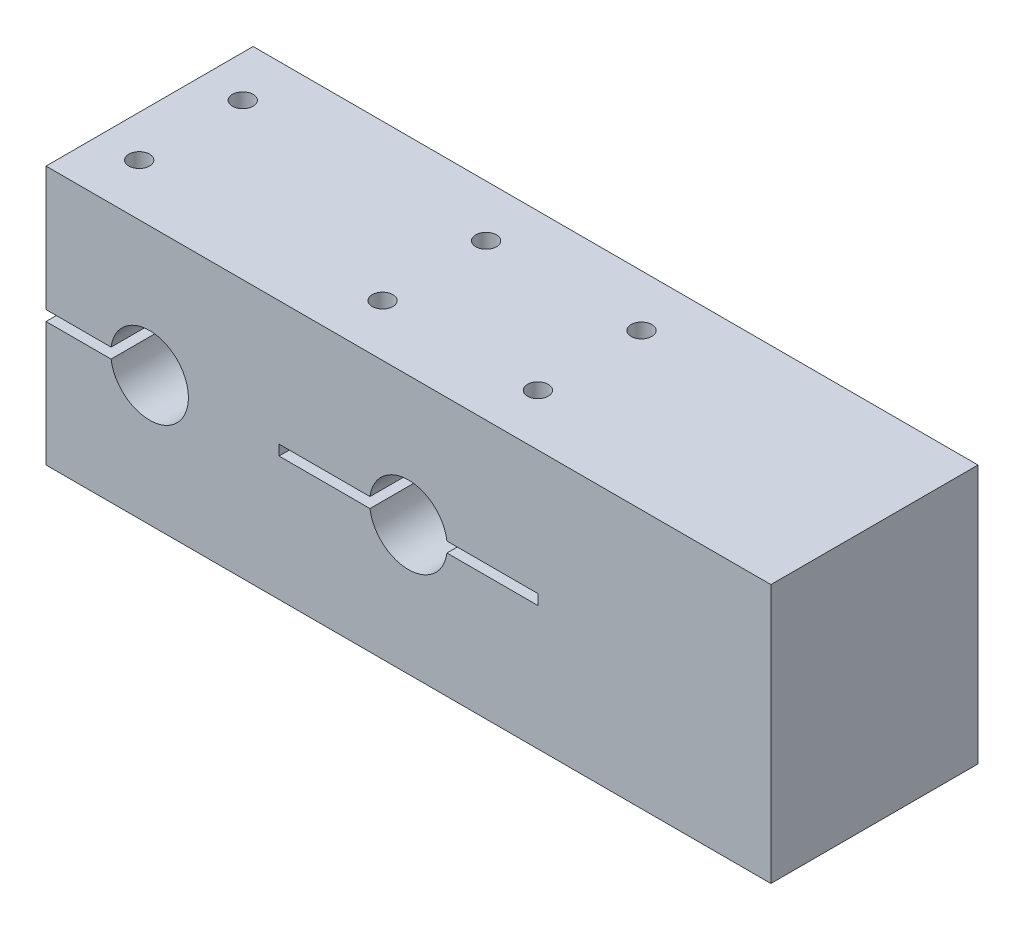
ISO-10303-21;
HEADER;
FILE_DESCRIPTION(('STEP AP214'),'2;1');
FILE_NAME('part.step','',(''),(''),'','','');
FILE_SCHEMA(('AUTOMOTIVE_DESIGN { 1 0 10303 214 1 1 1 1 }'));
ENDSEC;
DATA;
#1=APPLICATION_CONTEXT('core data for automotive mechanical design processes');
#2=APPLICATION_PROTOCOL_DEFINITION('international standard','automotive_design',2000,#1);
#3=PRODUCT_CONTEXT('',#1,'mechanical');
#4=PRODUCT('Part','Part','',(#3));
#5=PRODUCT_RELATED_PRODUCT_CATEGORY('part','',(#4));
#6=PRODUCT_DEFINITION_FORMATION('','',#4);
#7=PRODUCT_DEFINITION_CONTEXT('part definition',#1,'design');
#8=PRODUCT_DEFINITION('design','',#6,#7);
#9=PRODUCT_DEFINITION_SHAPE('','',#8);
#10=(LENGTH_UNIT() NAMED_UNIT(*) SI_UNIT(.MILLI.,.METRE.));
#11=(NAMED_UNIT(*) PLANE_ANGLE_UNIT() SI_UNIT($,.RADIAN.));
#12=(NAMED_UNIT(*) SI_UNIT($,.STERADIAN.) SOLID_ANGLE_UNIT());
#13=UNCERTAINTY_MEASURE_WITH_UNIT(LENGTH_MEASURE(1.E-05),#10,'distance_accuracy_value','');
#14=(GEOMETRIC_REPRESENTATION_CONTEXT(3) GLOBAL_UNCERTAINTY_ASSIGNED_CONTEXT((#13)) GLOBAL_UNIT_ASSIGNED_CONTEXT((#10,
#11,#12)) REPRESENTATION_CONTEXT('',''));
#15=CARTESIAN_POINT('',(0.,0.,0.));
#16=DIRECTION('',(0.,0.,1.));
#17=DIRECTION('',(1.,0.,0.));
#18=AXIS2_PLACEMENT_3D('',#15,#16,#17);
#19=CARTESIAN_POINT('',(20.,25.,40.));
#20=DIRECTION('',(0.,0.,1.));
#21=DIRECTION('',(1.,0.,0.));
#22=AXIS2_PLACEMENT_3D('',#19,#20,#21);
#23=PLANE('',#22);
#24=DIRECTION('',(0.,-1.,0.));
#25=VECTOR('',#24,1.);
#26=CARTESIAN_POINT('',(0.,0.,40.));
#27=LINE('',#26,#25);
#28=CARTESIAN_POINT('',(0.,24.,40.));
#29=VERTEX_POINT('',#28);
#30=CARTESIAN_POINT('',(0.,0.,40.));
#31=VERTEX_POINT('',#30);
#32=EDGE_CURVE('E217',#29,#31,#27,.T.);
#33=ORIENTED_EDGE('',*,*,#32,.T.);
#34=DIRECTION('',(1.,0.,0.));
#35=VECTOR('',#34,1.);
#36=CARTESIAN_POINT('',(0.,0.,40.));
#37=LINE('',#36,#35);
#38=CARTESIAN_POINT('',(140.,0.,40.));
#39=VERTEX_POINT('',#38);
#40=EDGE_CURVE('E220',#31,#39,#37,.T.);
#41=ORIENTED_EDGE('',*,*,#40,.T.);
#42=DIRECTION('',(0.,1.,0.));
#43=VECTOR('',#42,1.);
#44=CARTESIAN_POINT('',(140.,0.,40.));
#45=LINE('',#44,#43);
#46=CARTESIAN_POINT('',(140.,50.,40.));
#47=VERTEX_POINT('',#46);
#48=EDGE_CURVE('E223',#39,#47,#45,.T.);
#49=ORIENTED_EDGE('',*,*,#48,.T.);
#50=DIRECTION('',(-1.,0.,0.));
#51=VECTOR('',#50,1.);
#52=CARTESIAN_POINT('',(0.,50.,40.));
#53=LINE('',#52,#51);
#54=CARTESIAN_POINT('',(0.,50.,40.));
#55=VERTEX_POINT('',#54);
#56=EDGE_CURVE('E225',#47,#55,#53,.T.);
#57=ORIENTED_EDGE('',*,*,#56,.T.);
#58=DIRECTION('',(0.,-1.,0.));
#59=VECTOR('',#58,1.);
#60=CARTESIAN_POINT('',(0.,26.,40.));
#61=LINE('',#60,#59);
#62=CARTESIAN_POINT('',(0.,26.,40.));
#63=VERTEX_POINT('',#62);
#64=EDGE_CURVE('E227',#55,#63,#61,.T.);
#65=ORIENTED_EDGE('',*,*,#64,.T.);
#66=DIRECTION('',(1.,0.,0.));
#67=VECTOR('',#66,1.);
#68=CARTESIAN_POINT('',(0.,26.,40.));
#69=LINE('',#68,#67);
#70=CARTESIAN_POINT('',(12.5669656263407,26.,40.));
#71=VERTEX_POINT('',#70);
#72=EDGE_CURVE('E229',#63,#71,#69,.T.);
#73=ORIENTED_EDGE('',*,*,#72,.T.);
#74=CARTESIAN_POINT('',(20.,25.,40.));
#75=DIRECTION('',(0.,0.,-1.));
#76=DIRECTION('',(1.,0.,0.));
#77=AXIS2_PLACEMENT_3D('',#74,#75,#76);
#78=CIRCLE('',#77,7.5);
#79=CARTESIAN_POINT('',(12.5669656263407,24.,40.));
#80=VERTEX_POINT('',#79);
#81=EDGE_CURVE('E231',#71,#80,#78,.T.);
#82=ORIENTED_EDGE('',*,*,#81,.T.);
#83=DIRECTION('',(-1.,0.,0.));
#84=VECTOR('',#83,1.);
#85=CARTESIAN_POINT('',(0.,24.,40.));
#86=LINE('',#85,#84);
#87=EDGE_CURVE('E233',#80,#29,#86,.T.);
#88=ORIENTED_EDGE('',*,*,#87,.T.);
#89=EDGE_LOOP('',(#33,#41,#49,#57,#65,#73,#82,#88));
#90=FACE_BOUND('',#89,.T.);
#91=DIRECTION('',(1.,0.,0.));
#92=VECTOR('',#91,1.);
#93=CARTESIAN_POINT('',(77.4330343736593,24.,40.));
#94=LINE('',#93,#92);
#95=CARTESIAN_POINT('',(77.4330343736593,24.,40.));
#96=VERTEX_POINT('',#95);
#97=CARTESIAN_POINT('',(94.9976572078451,24.,40.));
#98=VERTEX_POINT('',#97);
#99=EDGE_CURVE('E158',#96,#98,#94,.T.);
#100=ORIENTED_EDGE('',*,*,#99,.F.);
#101=CARTESIAN_POINT('',(70.,25.,40.));
#102=DIRECTION('',(0.,0.,1.));
#103=DIRECTION('',(1.,0.,0.));
#104=AXIS2_PLACEMENT_3D('',#101,#102,#103);
#105=CIRCLE('',#104,7.50000000000001);
#106=CARTESIAN_POINT('',(62.5669656263407,24.,40.));
#107=VERTEX_POINT('',#106);
#108=EDGE_CURVE('E150',#107,#96,#105,.T.);
#109=ORIENTED_EDGE('',*,*,#108,.F.);
#110=DIRECTION('',(1.,0.,0.));
#111=VECTOR('',#110,1.);
#112=CARTESIAN_POINT('',(45.,24.,40.));
#113=LINE('',#112,#111);
#114=CARTESIAN_POINT('',(45.,24.,40.));
#115=VERTEX_POINT('',#114);
#116=EDGE_CURVE('E184',#115,#107,#113,.T.);
#117=ORIENTED_EDGE('',*,*,#116,.F.);
#118=DIRECTION('',(0.,-1.,0.));
#119=VECTOR('',#118,1.);
#120=CARTESIAN_POINT('',(45.,26.,40.));
#121=LINE('',#120,#119);
#122=CARTESIAN_POINT('',(45.,26.,40.));
#123=VERTEX_POINT('',#122);
#124=EDGE_CURVE('E182',#123,#115,#121,.T.);
#125=ORIENTED_EDGE('',*,*,#124,.F.);
#126=DIRECTION('',(-1.,0.,0.));
#127=VECTOR('',#126,1.);
#128=CARTESIAN_POINT('',(62.5669656263407,26.,40.));
#129=LINE('',#128,#127);
#130=CARTESIAN_POINT('',(62.5669656263407,26.,40.));
#131=VERTEX_POINT('',#130);
#132=EDGE_CURVE('E180',#131,#123,#129,.T.);
#133=ORIENTED_EDGE('',*,*,#132,.F.);
#134=CARTESIAN_POINT('',(70.,25.,40.));
#135=DIRECTION('',(0.,0.,1.));
#136=DIRECTION('',(1.,0.,0.));
#137=AXIS2_PLACEMENT_3D('',#134,#135,#136);
#138=CIRCLE('',#137,7.50000000000001);
#139=CARTESIAN_POINT('',(77.4330343736593,26.,40.));
#140=VERTEX_POINT('',#139);
#141=EDGE_CURVE('E178',#140,#131,#138,.T.);
#142=ORIENTED_EDGE('',*,*,#141,.F.);
#143=DIRECTION('',(-1.,0.,0.));
#144=VECTOR('',#143,1.);
#145=CARTESIAN_POINT('',(94.9976572078451,26.,40.));
#146=LINE('',#145,#144);
#147=CARTESIAN_POINT('',(94.9976572078451,26.,40.));
#148=VERTEX_POINT('',#147);
#149=EDGE_CURVE('E173',#148,#140,#146,.T.);
#150=ORIENTED_EDGE('',*,*,#149,.F.);
#151=DIRECTION('',(0.,1.,0.));
#152=VECTOR('',#151,1.);
#153=CARTESIAN_POINT('',(94.9976572078451,24.,40.));
#154=LINE('',#153,#152);
#155=EDGE_CURVE('E171',#98,#148,#154,.T.);
#156=ORIENTED_EDGE('',*,*,#155,.F.);
#157=EDGE_LOOP('',(#100,#109,#117,#125,#133,#142,#150,#156));
#158=FACE_BOUND('',#157,.T.);
#159=ADVANCED_FACE('F35',(#90,#158),#23,.T.);
#160=CARTESIAN_POINT('',(20.,25.,0.));
#161=DIRECTION('',(0.,0.,1.));
#162=DIRECTION('',(1.,0.,0.));
#163=AXIS2_PLACEMENT_3D('',#160,#161,#162);
#164=PLANE('',#163);
#165=DIRECTION('',(0.,-1.,0.));
#166=VECTOR('',#165,1.);
#167=CARTESIAN_POINT('',(0.,0.,0.));
#168=LINE('',#167,#166);
#169=CARTESIAN_POINT('',(0.,24.,0.));
#170=VERTEX_POINT('',#169);
#171=CARTESIAN_POINT('',(0.,0.,0.));
#172=VERTEX_POINT('',#171);
#173=EDGE_CURVE('E166',#170,#172,#168,.T.);
#174=ORIENTED_EDGE('',*,*,#173,.F.);
#175=DIRECTION('',(-1.,0.,0.));
#176=VECTOR('',#175,1.);
#177=CARTESIAN_POINT('',(0.,24.,0.));
#178=LINE('',#177,#176);
#179=CARTESIAN_POINT('',(12.5669656263407,24.,0.));
#180=VERTEX_POINT('',#179);
#181=EDGE_CURVE('E221',#180,#170,#178,.T.);
#182=ORIENTED_EDGE('',*,*,#181,.F.);
#183=CARTESIAN_POINT('',(20.,25.,0.));
#184=DIRECTION('',(0.,0.,-1.));
#185=DIRECTION('',(1.,0.,0.));
#186=AXIS2_PLACEMENT_3D('',#183,#184,#185);
#187=CIRCLE('',#186,7.5);
#188=CARTESIAN_POINT('',(12.5669656263407,26.,0.));
#189=VERTEX_POINT('',#188);
#190=EDGE_CURVE('E249',#189,#180,#187,.T.);
#191=ORIENTED_EDGE('',*,*,#190,.F.);
#192=DIRECTION('',(1.,0.,0.));
#193=VECTOR('',#192,1.);
#194=CARTESIAN_POINT('',(0.,26.,0.));
#195=LINE('',#194,#193);
#196=CARTESIAN_POINT('',(0.,26.,0.));
#197=VERTEX_POINT('',#196);
#198=EDGE_CURVE('E247',#197,#189,#195,.T.);
#199=ORIENTED_EDGE('',*,*,#198,.F.);
#200=DIRECTION('',(0.,-1.,0.));
#201=VECTOR('',#200,1.);
#202=CARTESIAN_POINT('',(0.,26.,0.));
#203=LINE('',#202,#201);
#204=CARTESIAN_POINT('',(0.,50.,0.));
#205=VERTEX_POINT('',#204);
#206=EDGE_CURVE('E245',#205,#197,#203,.T.);
#207=ORIENTED_EDGE('',*,*,#206,.F.);
#208=DIRECTION('',(-1.,0.,0.));
#209=VECTOR('',#208,1.);
#210=CARTESIAN_POINT('',(0.,50.,0.));
#211=LINE('',#210,#209);
#212=CARTESIAN_POINT('',(140.,50.,0.));
#213=VERTEX_POINT('',#212);
#214=EDGE_CURVE('E243',#213,#205,#211,.T.);
#215=ORIENTED_EDGE('',*,*,#214,.F.);
#216=DIRECTION('',(0.,1.,0.));
#217=VECTOR('',#216,1.);
#218=CARTESIAN_POINT('',(140.,34.,0.));
#219=LINE('',#218,#217);
#220=CARTESIAN_POINT('',(140.,0.,0.));
#221=VERTEX_POINT('',#220);
#222=EDGE_CURVE('E241',#221,#213,#219,.T.);
#223=ORIENTED_EDGE('',*,*,#222,.F.);
#224=DIRECTION('',(1.,0.,0.));
#225=VECTOR('',#224,1.);
#226=CARTESIAN_POINT('',(0.,0.,0.));
#227=LINE('',#226,#225);
#228=EDGE_CURVE('E238',#172,#221,#227,.T.);
#229=ORIENTED_EDGE('',*,*,#228,.F.);
#230=EDGE_LOOP('',(#174,#182,#191,#199,#207,#215,#223,#229));
#231=FACE_BOUND('',#230,.T.);
#232=CARTESIAN_POINT('',(70.,25.,0.));
#233=DIRECTION('',(0.,0.,1.));
#234=DIRECTION('',(1.,0.,0.));
#235=AXIS2_PLACEMENT_3D('',#232,#233,#234);
#236=CIRCLE('',#235,7.50000000000001);
#237=CARTESIAN_POINT('',(62.5669656263407,24.,0.));
#238=VERTEX_POINT('',#237);
#239=CARTESIAN_POINT('',(77.4330343736593,24.,0.));
#240=VERTEX_POINT('',#239);
#241=EDGE_CURVE('E60',#238,#240,#236,.T.);
#242=ORIENTED_EDGE('',*,*,#241,.T.);
#243=DIRECTION('',(1.,0.,0.));
#244=VECTOR('',#243,1.);
#245=CARTESIAN_POINT('',(77.4330343736593,24.,0.));
#246=LINE('',#245,#244);
#247=CARTESIAN_POINT('',(94.9976572078451,24.,0.));
#248=VERTEX_POINT('',#247);
#249=EDGE_CURVE('E165',#240,#248,#246,.T.);
#250=ORIENTED_EDGE('',*,*,#249,.T.);
#251=DIRECTION('',(0.,1.,0.));
#252=VECTOR('',#251,1.);
#253=CARTESIAN_POINT('',(94.9976572078451,24.,0.));
#254=LINE('',#253,#252);
#255=CARTESIAN_POINT('',(94.9976572078451,26.,0.));
#256=VERTEX_POINT('',#255);
#257=EDGE_CURVE('E189',#248,#256,#254,.T.);
#258=ORIENTED_EDGE('',*,*,#257,.T.);
#259=DIRECTION('',(-1.,0.,0.));
#260=VECTOR('',#259,1.);
#261=CARTESIAN_POINT('',(94.9976572078451,26.,0.));
#262=LINE('',#261,#260);
#263=CARTESIAN_POINT('',(77.4330343736593,26.,0.));
#264=VERTEX_POINT('',#263);
#265=EDGE_CURVE('E192',#256,#264,#262,.T.);
#266=ORIENTED_EDGE('',*,*,#265,.T.);
#267=CARTESIAN_POINT('',(70.,25.,0.));
#268=DIRECTION('',(0.,0.,1.));
#269=DIRECTION('',(1.,0.,0.));
#270=AXIS2_PLACEMENT_3D('',#267,#268,#269);
#271=CIRCLE('',#270,7.50000000000001);
#272=CARTESIAN_POINT('',(62.5669656263407,26.,0.));
#273=VERTEX_POINT('',#272);
#274=EDGE_CURVE('E195',#264,#273,#271,.T.);
#275=ORIENTED_EDGE('',*,*,#274,.T.);
#276=DIRECTION('',(-1.,0.,0.));
#277=VECTOR('',#276,1.);
#278=CARTESIAN_POINT('',(62.5669656263407,26.,0.));
#279=LINE('',#278,#277);
#280=CARTESIAN_POINT('',(45.,26.,0.));
#281=VERTEX_POINT('',#280);
#282=EDGE_CURVE('E198',#273,#281,#279,.T.);
#283=ORIENTED_EDGE('',*,*,#282,.T.);
#284=DIRECTION('',(0.,-1.,0.));
#285=VECTOR('',#284,1.);
#286=CARTESIAN_POINT('',(45.,26.,0.));
#287=LINE('',#286,#285);
#288=CARTESIAN_POINT('',(45.,24.,0.));
#289=VERTEX_POINT('',#288);
#290=EDGE_CURVE('E201',#281,#289,#287,.T.);
#291=ORIENTED_EDGE('',*,*,#290,.T.);
#292=DIRECTION('',(1.,0.,0.));
#293=VECTOR('',#292,1.);
#294=CARTESIAN_POINT('',(45.,24.,0.));
#295=LINE('',#294,#293);
#296=EDGE_CURVE('E159',#289,#238,#295,.T.);
#297=ORIENTED_EDGE('',*,*,#296,.T.);
#298=EDGE_LOOP('',(#242,#250,#258,#266,#275,#283,#291,#297));
#299=FACE_BOUND('',#298,.T.);
#300=ADVANCED_FACE('F357',(#231,#299),#164,.F.);
#301=CARTESIAN_POINT('',(0.,0.,40.));
#302=DIRECTION('',(1.,0.,0.));
#303=DIRECTION('',(0.,1.,0.));
#304=AXIS2_PLACEMENT_3D('',#301,#302,#303);
#305=PLANE('',#304);
#306=ORIENTED_EDGE('',*,*,#173,.T.);
#307=DIRECTION('',(0.,0.,-1.));
#308=VECTOR('',#307,1.);
#309=CARTESIAN_POINT('',(0.,0.,40.));
#310=LINE('',#309,#308);
#311=EDGE_CURVE('E11',#31,#172,#310,.T.);
#312=ORIENTED_EDGE('',*,*,#311,.F.);
#313=ORIENTED_EDGE('',*,*,#32,.F.);
#314=DIRECTION('',(0.,0.,-1.));
#315=VECTOR('',#314,1.);
#316=CARTESIAN_POINT('',(0.,24.,40.));
#317=LINE('',#316,#315);
#318=EDGE_CURVE('E235',#29,#170,#317,.T.);
#319=ORIENTED_EDGE('',*,*,#318,.T.);
#320=EDGE_LOOP('',(#306,#312,#313,#319));
#321=FACE_BOUND('',#320,.T.);
#322=ADVANCED_FACE('F37',(#321),#305,.F.);
#323=CARTESIAN_POINT('',(0.,0.,40.));
#324=DIRECTION('',(0.,1.,0.));
#325=DIRECTION('',(0.,0.,1.));
#326=AXIS2_PLACEMENT_3D('',#323,#324,#325);
#327=PLANE('',#326);
#328=CARTESIAN_POINT('',(85.,0.,10.));
#329=DIRECTION('',(0.,-1.,0.));
#330=DIRECTION('',(0.,0.,-1.));
#331=AXIS2_PLACEMENT_3D('',#328,#329,#330);
#332=CIRCLE('',#331,2.);
#333=CARTESIAN_POINT('',(85.,0.,8.));
#334=VERTEX_POINT('',#333);
#335=EDGE_CURVE('E400',#334,#334,#332,.T.);
#336=ORIENTED_EDGE('',*,*,#335,.F.);
#337=EDGE_LOOP('',(#336));
#338=FACE_BOUND('',#337,.T.);
#339=CARTESIAN_POINT('',(85.,0.,30.));
#340=DIRECTION('',(0.,-1.,0.));
#341=DIRECTION('',(0.,0.,-1.));
#342=AXIS2_PLACEMENT_3D('',#339,#340,#341);
#343=CIRCLE('',#342,2.);
#344=CARTESIAN_POINT('',(85.,0.,28.));
#345=VERTEX_POINT('',#344);
#346=EDGE_CURVE('E299',#345,#345,#343,.T.);
#347=ORIENTED_EDGE('',*,*,#346,.F.);
#348=EDGE_LOOP('',(#347));
#349=FACE_BOUND('',#348,.T.);
#350=CARTESIAN_POINT('',(55.,0.,10.));
#351=DIRECTION('',(0.,-1.,0.));
#352=DIRECTION('',(0.,0.,-1.));
#353=AXIS2_PLACEMENT_3D('',#350,#351,#352);
#354=CIRCLE('',#353,2.);
#355=CARTESIAN_POINT('',(55.,0.,8.));
#356=VERTEX_POINT('',#355);
#357=EDGE_CURVE('E296',#356,#356,#354,.T.);
#358=ORIENTED_EDGE('',*,*,#357,.F.);
#359=EDGE_LOOP('',(#358));
#360=FACE_BOUND('',#359,.T.);
#361=CARTESIAN_POINT('',(55.,0.,30.));
#362=DIRECTION('',(0.,-1.,0.));
#363=DIRECTION('',(0.,0.,-1.));
#364=AXIS2_PLACEMENT_3D('',#361,#362,#363);
#365=CIRCLE('',#364,2.);
#366=CARTESIAN_POINT('',(55.,0.,28.));
#367=VERTEX_POINT('',#366);
#368=EDGE_CURVE('E315',#367,#367,#365,.T.);
#369=ORIENTED_EDGE('',*,*,#368,.F.);
#370=EDGE_LOOP('',(#369));
#371=FACE_BOUND('',#370,.T.);
#372=CARTESIAN_POINT('',(8.,0.,10.));
#373=DIRECTION('',(0.,-1.,0.));
#374=DIRECTION('',(0.,0.,-1.));
#375=AXIS2_PLACEMENT_3D('',#372,#373,#374);
#376=CIRCLE('',#375,2.);
#377=CARTESIAN_POINT('',(8.,0.,8.));
#378=VERTEX_POINT('',#377);
#379=EDGE_CURVE('E322',#378,#378,#376,.T.);
#380=ORIENTED_EDGE('',*,*,#379,.F.);
#381=EDGE_LOOP('',(#380));
#382=FACE_BOUND('',#381,.T.);
#383=CARTESIAN_POINT('',(8.,0.,30.));
#384=DIRECTION('',(0.,-1.,0.));
#385=DIRECTION('',(0.,0.,-1.));
#386=AXIS2_PLACEMENT_3D('',#383,#384,#385);
#387=CIRCLE('',#386,2.);
#388=CARTESIAN_POINT('',(8.,0.,28.));
#389=VERTEX_POINT('',#388);
#390=EDGE_CURVE('E329',#389,#389,#387,.T.);
#391=ORIENTED_EDGE('',*,*,#390,.F.);
#392=EDGE_LOOP('',(#391));
#393=FACE_BOUND('',#392,.T.);
#394=ORIENTED_EDGE('',*,*,#228,.T.);
#395=DIRECTION('',(0.,0.,-1.));
#396=VECTOR('',#395,1.);
#397=CARTESIAN_POINT('',(140.,0.,40.));
#398=LINE('',#397,#396);
#399=EDGE_CURVE('E44',#39,#221,#398,.T.);
#400=ORIENTED_EDGE('',*,*,#399,.F.);
#401=ORIENTED_EDGE('',*,*,#40,.F.);
#402=ORIENTED_EDGE('',*,*,#311,.T.);
#403=EDGE_LOOP('',(#394,#400,#401,#402));
#404=FACE_BOUND('',#403,.T.);
#405=ADVANCED_FACE('F389',(#338,#349,#360,#371,#382,#393,#404),#327,.F.);
#406=CARTESIAN_POINT('',(140.,34.,40.));
#407=DIRECTION('',(-1.,0.,0.));
#408=DIRECTION('',(0.,0.,1.));
#409=AXIS2_PLACEMENT_3D('',#406,#407,#408);
#410=PLANE('',#409);
#411=ORIENTED_EDGE('',*,*,#222,.T.);
#412=DIRECTION('',(0.,0.,-1.));
#413=VECTOR('',#412,1.);
#414=CARTESIAN_POINT('',(140.,50.,40.));
#415=LINE('',#414,#413);
#416=EDGE_CURVE('E266',#47,#213,#415,.T.);
#417=ORIENTED_EDGE('',*,*,#416,.F.);
#418=ORIENTED_EDGE('',*,*,#48,.F.);
#419=ORIENTED_EDGE('',*,*,#399,.T.);
#420=EDGE_LOOP('',(#411,#417,#418,#419));
#421=FACE_BOUND('',#420,.T.);
#422=ADVANCED_FACE('F386',(#421),#410,.F.);
#423=CARTESIAN_POINT('',(0.,50.,40.));
#424=DIRECTION('',(0.,-1.,0.));
#425=DIRECTION('',(0.,0.,-1.));
#426=AXIS2_PLACEMENT_3D('',#423,#424,#425);
#427=PLANE('',#426);
#428=CARTESIAN_POINT('',(85.,50.,10.));
#429=DIRECTION('',(0.,-1.,0.));
#430=DIRECTION('',(0.,0.,-1.));
#431=AXIS2_PLACEMENT_3D('',#428,#429,#430);
#432=CIRCLE('',#431,2.);
#433=CARTESIAN_POINT('',(85.,50.,8.));
#434=VERTEX_POINT('',#433);
#435=EDGE_CURVE('E517',#434,#434,#432,.T.);
#436=ORIENTED_EDGE('',*,*,#435,.T.);
#437=EDGE_LOOP('',(#436));
#438=FACE_BOUND('',#437,.T.);
#439=CARTESIAN_POINT('',(85.,50.,30.));
#440=DIRECTION('',(0.,-1.,0.));
#441=DIRECTION('',(0.,0.,-1.));
#442=AXIS2_PLACEMENT_3D('',#439,#440,#441);
#443=CIRCLE('',#442,2.);
#444=CARTESIAN_POINT('',(85.,50.,28.));
#445=VERTEX_POINT('',#444);
#446=EDGE_CURVE('E292',#445,#445,#443,.T.);
#447=ORIENTED_EDGE('',*,*,#446,.T.);
#448=EDGE_LOOP('',(#447));
#449=FACE_BOUND('',#448,.T.);
#450=CARTESIAN_POINT('',(55.,50.,10.));
#451=DIRECTION('',(0.,-1.,0.));
#452=DIRECTION('',(0.,0.,-1.));
#453=AXIS2_PLACEMENT_3D('',#450,#451,#452);
#454=CIRCLE('',#453,2.);
#455=CARTESIAN_POINT('',(55.,50.,8.));
#456=VERTEX_POINT('',#455);
#457=EDGE_CURVE('E288',#456,#456,#454,.T.);
#458=ORIENTED_EDGE('',*,*,#457,.T.);
#459=EDGE_LOOP('',(#458));
#460=FACE_BOUND('',#459,.T.);
#461=CARTESIAN_POINT('',(55.,50.,30.));
#462=DIRECTION('',(0.,-1.,0.));
#463=DIRECTION('',(0.,0.,-1.));
#464=AXIS2_PLACEMENT_3D('',#461,#462,#463);
#465=CIRCLE('',#464,2.);
#466=CARTESIAN_POINT('',(55.,50.,28.));
#467=VERTEX_POINT('',#466);
#468=EDGE_CURVE('E284',#467,#467,#465,.T.);
#469=ORIENTED_EDGE('',*,*,#468,.T.);
#470=EDGE_LOOP('',(#469));
#471=FACE_BOUND('',#470,.T.);
#472=CARTESIAN_POINT('',(8.,50.,10.));
#473=DIRECTION('',(0.,-1.,0.));
#474=DIRECTION('',(0.,0.,-1.));
#475=AXIS2_PLACEMENT_3D('',#472,#473,#474);
#476=CIRCLE('',#475,2.);
#477=CARTESIAN_POINT('',(8.,50.,8.));
#478=VERTEX_POINT('',#477);
#479=EDGE_CURVE('E279',#478,#478,#476,.T.);
#480=ORIENTED_EDGE('',*,*,#479,.T.);
#481=EDGE_LOOP('',(#480));
#482=FACE_BOUND('',#481,.T.);
#483=CARTESIAN_POINT('',(8.,50.,30.));
#484=DIRECTION('',(0.,-1.,0.));
#485=DIRECTION('',(0.,0.,-1.));
#486=AXIS2_PLACEMENT_3D('',#483,#484,#485);
#487=CIRCLE('',#486,2.);
#488=CARTESIAN_POINT('',(8.,50.,28.));
#489=VERTEX_POINT('',#488);
#490=EDGE_CURVE('E274',#489,#489,#487,.T.);
#491=ORIENTED_EDGE('',*,*,#490,.T.);
#492=EDGE_LOOP('',(#491));
#493=FACE_BOUND('',#492,.T.);
#494=ORIENTED_EDGE('',*,*,#214,.T.);
#495=DIRECTION('',(0.,0.,-1.));
#496=VECTOR('',#495,1.);
#497=CARTESIAN_POINT('',(0.,50.,40.));
#498=LINE('',#497,#496);
#499=EDGE_CURVE('E263',#55,#205,#498,.T.);
#500=ORIENTED_EDGE('',*,*,#499,.F.);
#501=ORIENTED_EDGE('',*,*,#56,.F.);
#502=ORIENTED_EDGE('',*,*,#416,.T.);
#503=EDGE_LOOP('',(#494,#500,#501,#502));
#504=FACE_BOUND('',#503,.T.);
#505=ADVANCED_FACE('F382',(#438,#449,#460,#471,#482,#493,#504),#427,.F.);
#506=CARTESIAN_POINT('',(0.,26.,40.));
#507=DIRECTION('',(1.,0.,0.));
#508=DIRECTION('',(0.,0.,-1.));
#509=AXIS2_PLACEMENT_3D('',#506,#507,#508);
#510=PLANE('',#509);
#511=ORIENTED_EDGE('',*,*,#206,.T.);
#512=DIRECTION('',(0.,0.,-1.));
#513=VECTOR('',#512,1.);
#514=CARTESIAN_POINT('',(0.,26.,40.));
#515=LINE('',#514,#513);
#516=EDGE_CURVE('E260',#63,#197,#515,.T.);
#517=ORIENTED_EDGE('',*,*,#516,.F.);
#518=ORIENTED_EDGE('',*,*,#64,.F.);
#519=ORIENTED_EDGE('',*,*,#499,.T.);
#520=EDGE_LOOP('',(#511,#517,#518,#519));
#521=FACE_BOUND('',#520,.T.);
#522=ADVANCED_FACE('F378',(#521),#510,.F.);
#523=CARTESIAN_POINT('',(0.,26.,40.));
#524=DIRECTION('',(0.,1.,0.));
#525=DIRECTION('',(0.,0.,1.));
#526=AXIS2_PLACEMENT_3D('',#523,#524,#525);
#527=PLANE('',#526);
#528=CARTESIAN_POINT('',(8.,26.,10.));
#529=DIRECTION('',(0.,1.,0.));
#530=DIRECTION('',(0.,0.,1.));
#531=AXIS2_PLACEMENT_3D('',#528,#529,#530);
#532=CIRCLE('',#531,2.);
#533=CARTESIAN_POINT('',(8.,26.,12.));
#534=VERTEX_POINT('',#533);
#535=EDGE_CURVE('E278',#534,#534,#532,.T.);
#536=ORIENTED_EDGE('',*,*,#535,.T.);
#537=EDGE_LOOP('',(#536));
#538=FACE_BOUND('',#537,.T.);
#539=CARTESIAN_POINT('',(8.,26.,30.));
#540=DIRECTION('',(0.,1.,0.));
#541=DIRECTION('',(0.,0.,1.));
#542=AXIS2_PLACEMENT_3D('',#539,#540,#541);
#543=CIRCLE('',#542,2.);
#544=CARTESIAN_POINT('',(8.,26.,32.));
#545=VERTEX_POINT('',#544);
#546=EDGE_CURVE('E187',#545,#545,#543,.T.);
#547=ORIENTED_EDGE('',*,*,#546,.T.);
#548=EDGE_LOOP('',(#547));
#549=FACE_BOUND('',#548,.T.);
#550=ORIENTED_EDGE('',*,*,#198,.T.);
#551=DIRECTION('',(0.,0.,-1.));
#552=VECTOR('',#551,1.);
#553=CARTESIAN_POINT('',(12.5669656263407,26.,40.));
#554=LINE('',#553,#552);
#555=EDGE_CURVE('E257',#71,#189,#554,.T.);
#556=ORIENTED_EDGE('',*,*,#555,.F.);
#557=ORIENTED_EDGE('',*,*,#72,.F.);
#558=ORIENTED_EDGE('',*,*,#516,.T.);
#559=EDGE_LOOP('',(#550,#556,#557,#558));
#560=FACE_BOUND('',#559,.T.);
#561=ADVANCED_FACE('F336',(#538,#549,#560),#527,.F.);
#562=CARTESIAN_POINT('',(20.,25.,40.));
#563=DIRECTION('',(0.,0.,-1.));
#564=DIRECTION('',(-1.,0.,0.));
#565=AXIS2_PLACEMENT_3D('',#562,#563,#564);
#566=CYLINDRICAL_SURFACE('',#565,7.5);
#567=ORIENTED_EDGE('',*,*,#190,.T.);
#568=DIRECTION('',(0.,0.,-1.));
#569=VECTOR('',#568,1.);
#570=CARTESIAN_POINT('',(12.5669656263407,24.,40.));
#571=LINE('',#570,#569);
#572=EDGE_CURVE('E254',#80,#180,#571,.T.);
#573=ORIENTED_EDGE('',*,*,#572,.F.);
#574=ORIENTED_EDGE('',*,*,#81,.F.);
#575=ORIENTED_EDGE('',*,*,#555,.T.);
#576=EDGE_LOOP('',(#567,#573,#574,#575));
#577=FACE_BOUND('',#576,.T.);
#578=ADVANCED_FACE('F371',(#577),#566,.F.);
#579=CARTESIAN_POINT('',(0.,24.,40.));
#580=DIRECTION('',(0.,-1.,0.));
#581=DIRECTION('',(0.,0.,-1.));
#582=AXIS2_PLACEMENT_3D('',#579,#580,#581);
#583=PLANE('',#582);
#584=CARTESIAN_POINT('',(8.,24.,10.));
#585=DIRECTION('',(0.,-1.,0.));
#586=DIRECTION('',(0.,0.,-1.));
#587=AXIS2_PLACEMENT_3D('',#584,#585,#586);
#588=CIRCLE('',#587,2.);
#589=CARTESIAN_POINT('',(8.,24.,8.));
#590=VERTEX_POINT('',#589);
#591=EDGE_CURVE('E275',#590,#590,#588,.T.);
#592=ORIENTED_EDGE('',*,*,#591,.T.);
#593=EDGE_LOOP('',(#592));
#594=FACE_BOUND('',#593,.T.);
#595=CARTESIAN_POINT('',(8.,24.,30.));
#596=DIRECTION('',(0.,-1.,0.));
#597=DIRECTION('',(0.,0.,-1.));
#598=AXIS2_PLACEMENT_3D('',#595,#596,#597);
#599=CIRCLE('',#598,2.);
#600=CARTESIAN_POINT('',(8.,24.,28.));
#601=VERTEX_POINT('',#600);
#602=EDGE_CURVE('E271',#601,#601,#599,.T.);
#603=ORIENTED_EDGE('',*,*,#602,.T.);
#604=EDGE_LOOP('',(#603));
#605=FACE_BOUND('',#604,.T.);
#606=ORIENTED_EDGE('',*,*,#181,.T.);
#607=ORIENTED_EDGE('',*,*,#318,.F.);
#608=ORIENTED_EDGE('',*,*,#87,.F.);
#609=ORIENTED_EDGE('',*,*,#572,.T.);
#610=EDGE_LOOP('',(#606,#607,#608,#609));
#611=FACE_BOUND('',#610,.T.);
#612=ADVANCED_FACE('F368',(#594,#605,#611),#583,.F.);
#613=CARTESIAN_POINT('',(70.,25.,40.));
#614=DIRECTION('',(0.,0.,-1.));
#615=DIRECTION('',(-1.,0.,0.));
#616=AXIS2_PLACEMENT_3D('',#613,#614,#615);
#617=CYLINDRICAL_SURFACE('',#616,7.50000000000001);
#618=ORIENTED_EDGE('',*,*,#241,.F.);
#619=DIRECTION('',(0.,0.,-1.));
#620=VECTOR('',#619,1.);
#621=CARTESIAN_POINT('',(62.5669656263407,24.,40.));
#622=LINE('',#621,#620);
#623=EDGE_CURVE('E154',#107,#238,#622,.T.);
#624=ORIENTED_EDGE('',*,*,#623,.F.);
#625=ORIENTED_EDGE('',*,*,#108,.T.);
#626=DIRECTION('',(0.,0.,-1.));
#627=VECTOR('',#626,1.);
#628=CARTESIAN_POINT('',(77.4330343736593,24.,40.));
#629=LINE('',#628,#627);
#630=EDGE_CURVE('E153',#96,#240,#629,.T.);
#631=ORIENTED_EDGE('',*,*,#630,.T.);
#632=EDGE_LOOP('',(#618,#624,#625,#631));
#633=FACE_BOUND('',#632,.T.);
#634=ADVANCED_FACE('F152',(#633),#617,.F.);
#635=CARTESIAN_POINT('',(77.4330343736593,24.,40.));
#636=DIRECTION('',(0.,1.,0.));
#637=DIRECTION('',(0.,0.,1.));
#638=AXIS2_PLACEMENT_3D('',#635,#636,#637);
#639=PLANE('',#638);
#640=CARTESIAN_POINT('',(85.,24.,10.));
#641=DIRECTION('',(0.,1.,0.));
#642=DIRECTION('',(0.,0.,1.));
#643=AXIS2_PLACEMENT_3D('',#640,#641,#642);
#644=CIRCLE('',#643,2.);
#645=CARTESIAN_POINT('',(85.,24.,12.));
#646=VERTEX_POINT('',#645);
#647=EDGE_CURVE('E304',#646,#646,#644,.T.);
#648=ORIENTED_EDGE('',*,*,#647,.F.);
#649=EDGE_LOOP('',(#648));
#650=FACE_BOUND('',#649,.T.);
#651=CARTESIAN_POINT('',(85.,24.,30.));
#652=DIRECTION('',(0.,1.,0.));
#653=DIRECTION('',(0.,0.,1.));
#654=AXIS2_PLACEMENT_3D('',#651,#652,#653);
#655=CIRCLE('',#654,2.);
#656=CARTESIAN_POINT('',(85.,24.,32.));
#657=VERTEX_POINT('',#656);
#658=EDGE_CURVE('E291',#657,#657,#655,.T.);
#659=ORIENTED_EDGE('',*,*,#658,.F.);
#660=EDGE_LOOP('',(#659));
#661=FACE_BOUND('',#660,.T.);
#662=ORIENTED_EDGE('',*,*,#249,.F.);
#663=ORIENTED_EDGE('',*,*,#630,.F.);
#664=ORIENTED_EDGE('',*,*,#99,.T.);
#665=DIRECTION('',(0.,0.,-1.));
#666=VECTOR('',#665,1.);
#667=CARTESIAN_POINT('',(94.9976572078451,24.,40.));
#668=LINE('',#667,#666);
#669=EDGE_CURVE('E167',#98,#248,#668,.T.);
#670=ORIENTED_EDGE('',*,*,#669,.T.);
#671=EDGE_LOOP('',(#662,#663,#664,#670));
#672=FACE_BOUND('',#671,.T.);
#673=ADVANCED_FACE('F162',(#650,#661,#672),#639,.T.);
#674=CARTESIAN_POINT('',(94.9976572078451,24.,40.));
#675=DIRECTION('',(-1.,0.,0.));
#676=DIRECTION('',(0.,0.,1.));
#677=AXIS2_PLACEMENT_3D('',#674,#675,#676);
#678=PLANE('',#677);
#679=ORIENTED_EDGE('',*,*,#257,.F.);
#680=ORIENTED_EDGE('',*,*,#669,.F.);
#681=ORIENTED_EDGE('',*,*,#155,.T.);
#682=DIRECTION('',(0.,0.,-1.));
#683=VECTOR('',#682,1.);
#684=CARTESIAN_POINT('',(94.9976572078451,26.,40.));
#685=LINE('',#684,#683);
#686=EDGE_CURVE('E214',#148,#256,#685,.T.);
#687=ORIENTED_EDGE('',*,*,#686,.T.);
#688=EDGE_LOOP('',(#679,#680,#681,#687));
#689=FACE_BOUND('',#688,.T.);
#690=ADVANCED_FACE('F456',(#689),#678,.T.);
#691=CARTESIAN_POINT('',(94.9976572078451,26.,40.));
#692=DIRECTION('',(0.,-1.,0.));
#693=DIRECTION('',(1.,0.,0.));
#694=AXIS2_PLACEMENT_3D('',#691,#692,#693);
#695=PLANE('',#694);
#696=CARTESIAN_POINT('',(85.,26.,10.));
#697=DIRECTION('',(0.,-1.,0.));
#698=DIRECTION('',(1.,0.,0.));
#699=AXIS2_PLACEMENT_3D('',#696,#697,#698);
#700=CIRCLE('',#699,2.);
#701=CARTESIAN_POINT('',(87.,26.,10.));
#702=VERTEX_POINT('',#701);
#703=EDGE_CURVE('E39',#702,#702,#700,.T.);
#704=ORIENTED_EDGE('',*,*,#703,.F.);
#705=EDGE_LOOP('',(#704));
#706=FACE_BOUND('',#705,.T.);
#707=CARTESIAN_POINT('',(85.,26.,30.));
#708=DIRECTION('',(0.,-1.,0.));
#709=DIRECTION('',(1.,0.,0.));
#710=AXIS2_PLACEMENT_3D('',#707,#708,#709);
#711=CIRCLE('',#710,2.);
#712=CARTESIAN_POINT('',(87.,26.,30.));
#713=VERTEX_POINT('',#712);
#714=EDGE_CURVE('E289',#713,#713,#711,.T.);
#715=ORIENTED_EDGE('',*,*,#714,.F.);
#716=EDGE_LOOP('',(#715));
#717=FACE_BOUND('',#716,.T.);
#718=ORIENTED_EDGE('',*,*,#265,.F.);
#719=ORIENTED_EDGE('',*,*,#686,.F.);
#720=ORIENTED_EDGE('',*,*,#149,.T.);
#721=DIRECTION('',(0.,0.,-1.));
#722=VECTOR('',#721,1.);
#723=CARTESIAN_POINT('',(77.4330343736593,26.,40.));
#724=LINE('',#723,#722);
#725=EDGE_CURVE('E212',#140,#264,#724,.T.);
#726=ORIENTED_EDGE('',*,*,#725,.T.);
#727=EDGE_LOOP('',(#718,#719,#720,#726));
#728=FACE_BOUND('',#727,.T.);
#729=ADVANCED_FACE('F453',(#706,#717,#728),#695,.T.);
#730=CARTESIAN_POINT('',(70.,25.,40.));
#731=DIRECTION('',(0.,0.,-1.));
#732=DIRECTION('',(-1.,0.,0.));
#733=AXIS2_PLACEMENT_3D('',#730,#731,#732);
#734=CYLINDRICAL_SURFACE('',#733,7.50000000000001);
#735=ORIENTED_EDGE('',*,*,#274,.F.);
#736=ORIENTED_EDGE('',*,*,#725,.F.);
#737=ORIENTED_EDGE('',*,*,#141,.T.);
#738=DIRECTION('',(0.,0.,-1.));
#739=VECTOR('',#738,1.);
#740=CARTESIAN_POINT('',(62.5669656263407,26.,40.));
#741=LINE('',#740,#739);
#742=EDGE_CURVE('E210',#131,#273,#741,.T.);
#743=ORIENTED_EDGE('',*,*,#742,.T.);
#744=EDGE_LOOP('',(#735,#736,#737,#743));
#745=FACE_BOUND('',#744,.T.);
#746=ADVANCED_FACE('F448',(#745),#734,.F.);
#747=CARTESIAN_POINT('',(62.5669656263407,26.,40.));
#748=DIRECTION('',(0.,-1.,0.));
#749=DIRECTION('',(1.,0.,0.));
#750=AXIS2_PLACEMENT_3D('',#747,#748,#749);
#751=PLANE('',#750);
#752=CARTESIAN_POINT('',(55.,26.,10.));
#753=DIRECTION('',(0.,-1.,0.));
#754=DIRECTION('',(1.,0.,0.));
#755=AXIS2_PLACEMENT_3D('',#752,#753,#754);
#756=CIRCLE('',#755,2.);
#757=CARTESIAN_POINT('',(57.,26.,10.));
#758=VERTEX_POINT('',#757);
#759=EDGE_CURVE('E287',#758,#758,#756,.T.);
#760=ORIENTED_EDGE('',*,*,#759,.F.);
#761=EDGE_LOOP('',(#760));
#762=FACE_BOUND('',#761,.T.);
#763=CARTESIAN_POINT('',(55.,26.,30.));
#764=DIRECTION('',(0.,-1.,0.));
#765=DIRECTION('',(1.,0.,0.));
#766=AXIS2_PLACEMENT_3D('',#763,#764,#765);
#767=CIRCLE('',#766,2.);
#768=CARTESIAN_POINT('',(57.,26.,30.));
#769=VERTEX_POINT('',#768);
#770=EDGE_CURVE('E283',#769,#769,#767,.T.);
#771=ORIENTED_EDGE('',*,*,#770,.F.);
#772=EDGE_LOOP('',(#771));
#773=FACE_BOUND('',#772,.T.);
#774=ORIENTED_EDGE('',*,*,#282,.F.);
#775=ORIENTED_EDGE('',*,*,#742,.F.);
#776=ORIENTED_EDGE('',*,*,#132,.T.);
#777=DIRECTION('',(0.,0.,-1.));
#778=VECTOR('',#777,1.);
#779=CARTESIAN_POINT('',(45.,26.,40.));
#780=LINE('',#779,#778);
#781=EDGE_CURVE('E208',#123,#281,#780,.T.);
#782=ORIENTED_EDGE('',*,*,#781,.T.);
#783=EDGE_LOOP('',(#774,#775,#776,#782));
#784=FACE_BOUND('',#783,.T.);
#785=ADVANCED_FACE('F444',(#762,#773,#784),#751,.T.);
#786=CARTESIAN_POINT('',(45.,26.,40.));
#787=DIRECTION('',(1.,0.,0.));
#788=DIRECTION('',(0.,0.,-1.));
#789=AXIS2_PLACEMENT_3D('',#786,#787,#788);
#790=PLANE('',#789);
#791=ORIENTED_EDGE('',*,*,#290,.F.);
#792=ORIENTED_EDGE('',*,*,#781,.F.);
#793=ORIENTED_EDGE('',*,*,#124,.T.);
#794=DIRECTION('',(0.,0.,-1.));
#795=VECTOR('',#794,1.);
#796=CARTESIAN_POINT('',(45.,24.,40.));
#797=LINE('',#796,#795);
#798=EDGE_CURVE('E52',#115,#289,#797,.T.);
#799=ORIENTED_EDGE('',*,*,#798,.T.);
#800=EDGE_LOOP('',(#791,#792,#793,#799));
#801=FACE_BOUND('',#800,.T.);
#802=ADVANCED_FACE('F441',(#801),#790,.T.);
#803=CARTESIAN_POINT('',(45.,24.,40.));
#804=DIRECTION('',(0.,1.,0.));
#805=DIRECTION('',(0.,0.,1.));
#806=AXIS2_PLACEMENT_3D('',#803,#804,#805);
#807=PLANE('',#806);
#808=CARTESIAN_POINT('',(55.,24.,10.));
#809=DIRECTION('',(0.,1.,0.));
#810=DIRECTION('',(0.,0.,1.));
#811=AXIS2_PLACEMENT_3D('',#808,#809,#810);
#812=CIRCLE('',#811,2.);
#813=CARTESIAN_POINT('',(55.,24.,12.));
#814=VERTEX_POINT('',#813);
#815=EDGE_CURVE('E285',#814,#814,#812,.T.);
#816=ORIENTED_EDGE('',*,*,#815,.F.);
#817=EDGE_LOOP('',(#816));
#818=FACE_BOUND('',#817,.T.);
#819=CARTESIAN_POINT('',(55.,24.,30.));
#820=DIRECTION('',(0.,1.,0.));
#821=DIRECTION('',(0.,0.,1.));
#822=AXIS2_PLACEMENT_3D('',#819,#820,#821);
#823=CIRCLE('',#822,2.);
#824=CARTESIAN_POINT('',(55.,24.,32.));
#825=VERTEX_POINT('',#824);
#826=EDGE_CURVE('E280',#825,#825,#823,.T.);
#827=ORIENTED_EDGE('',*,*,#826,.F.);
#828=EDGE_LOOP('',(#827));
#829=FACE_BOUND('',#828,.T.);
#830=ORIENTED_EDGE('',*,*,#296,.F.);
#831=ORIENTED_EDGE('',*,*,#798,.F.);
#832=ORIENTED_EDGE('',*,*,#116,.T.);
#833=ORIENTED_EDGE('',*,*,#623,.T.);
#834=EDGE_LOOP('',(#830,#831,#832,#833));
#835=FACE_BOUND('',#834,.T.);
#836=ADVANCED_FACE('F352',(#818,#829,#835),#807,.T.);
#837=CARTESIAN_POINT('',(8.,50.,30.));
#838=DIRECTION('',(0.,-1.,0.));
#839=DIRECTION('',(0.,0.,-1.));
#840=AXIS2_PLACEMENT_3D('',#837,#838,#839);
#841=CYLINDRICAL_SURFACE('',#840,2.);
#842=ORIENTED_EDGE('',*,*,#390,.T.);
#843=EDGE_LOOP('',(#842));
#844=FACE_BOUND('',#843,.T.);
#845=ORIENTED_EDGE('',*,*,#602,.F.);
#846=EDGE_LOOP('',(#845));
#847=FACE_BOUND('',#846,.T.);
#848=ADVANCED_FACE('F342',(#844,#847),#841,.F.);
#849=ORIENTED_EDGE('',*,*,#490,.F.);
#850=EDGE_LOOP('',(#849));
#851=FACE_BOUND('',#850,.T.);
#852=ORIENTED_EDGE('',*,*,#546,.F.);
#853=EDGE_LOOP('',(#852));
#854=FACE_BOUND('',#853,.T.);
#855=ADVANCED_FACE('F339',(#851,#854),#841,.F.);
#856=CARTESIAN_POINT('',(8.,50.,10.));
#857=DIRECTION('',(0.,-1.,0.));
#858=DIRECTION('',(0.,0.,-1.));
#859=AXIS2_PLACEMENT_3D('',#856,#857,#858);
#860=CYLINDRICAL_SURFACE('',#859,2.);
#861=ORIENTED_EDGE('',*,*,#379,.T.);
#862=EDGE_LOOP('',(#861));
#863=FACE_BOUND('',#862,.T.);
#864=ORIENTED_EDGE('',*,*,#591,.F.);
#865=EDGE_LOOP('',(#864));
#866=FACE_BOUND('',#865,.T.);
#867=ADVANCED_FACE('F341',(#863,#866),#860,.F.);
#868=ORIENTED_EDGE('',*,*,#479,.F.);
#869=EDGE_LOOP('',(#868));
#870=FACE_BOUND('',#869,.T.);
#871=ORIENTED_EDGE('',*,*,#535,.F.);
#872=EDGE_LOOP('',(#871));
#873=FACE_BOUND('',#872,.T.);
#874=ADVANCED_FACE('F349',(#870,#873),#860,.F.);
#875=CARTESIAN_POINT('',(55.,50.,30.));
#876=DIRECTION('',(0.,-1.,0.));
#877=DIRECTION('',(0.,0.,-1.));
#878=AXIS2_PLACEMENT_3D('',#875,#876,#877);
#879=CYLINDRICAL_SURFACE('',#878,2.);
#880=ORIENTED_EDGE('',*,*,#826,.T.);
#881=EDGE_LOOP('',(#880));
#882=FACE_BOUND('',#881,.T.);
#883=ORIENTED_EDGE('',*,*,#368,.T.);
#884=EDGE_LOOP('',(#883));
#885=FACE_BOUND('',#884,.T.);
#886=ADVANCED_FACE('F481',(#882,#885),#879,.F.);
#887=ORIENTED_EDGE('',*,*,#770,.T.);
#888=EDGE_LOOP('',(#887));
#889=FACE_BOUND('',#888,.T.);
#890=ORIENTED_EDGE('',*,*,#468,.F.);
#891=EDGE_LOOP('',(#890));
#892=FACE_BOUND('',#891,.T.);
#893=ADVANCED_FACE('F484',(#889,#892),#879,.F.);
#894=CARTESIAN_POINT('',(55.,50.,10.));
#895=DIRECTION('',(0.,-1.,0.));
#896=DIRECTION('',(0.,0.,-1.));
#897=AXIS2_PLACEMENT_3D('',#894,#895,#896);
#898=CYLINDRICAL_SURFACE('',#897,2.);
#899=ORIENTED_EDGE('',*,*,#815,.T.);
#900=EDGE_LOOP('',(#899));
#901=FACE_BOUND('',#900,.T.);
#902=ORIENTED_EDGE('',*,*,#357,.T.);
#903=EDGE_LOOP('',(#902));
#904=FACE_BOUND('',#903,.T.);
#905=ADVANCED_FACE('F490',(#901,#904),#898,.F.);
#906=ORIENTED_EDGE('',*,*,#759,.T.);
#907=EDGE_LOOP('',(#906));
#908=FACE_BOUND('',#907,.T.);
#909=ORIENTED_EDGE('',*,*,#457,.F.);
#910=EDGE_LOOP('',(#909));
#911=FACE_BOUND('',#910,.T.);
#912=ADVANCED_FACE('F496',(#908,#911),#898,.F.);
#913=CARTESIAN_POINT('',(85.,50.,30.));
#914=DIRECTION('',(0.,-1.,0.));
#915=DIRECTION('',(0.,0.,-1.));
#916=AXIS2_PLACEMENT_3D('',#913,#914,#915);
#917=CYLINDRICAL_SURFACE('',#916,2.);
#918=ORIENTED_EDGE('',*,*,#714,.T.);
#919=EDGE_LOOP('',(#918));
#920=FACE_BOUND('',#919,.T.);
#921=ORIENTED_EDGE('',*,*,#446,.F.);
#922=EDGE_LOOP('',(#921));
#923=FACE_BOUND('',#922,.T.);
#924=ADVANCED_FACE('F498',(#920,#923),#917,.F.);
#925=ORIENTED_EDGE('',*,*,#658,.T.);
#926=EDGE_LOOP('',(#925));
#927=FACE_BOUND('',#926,.T.);
#928=ORIENTED_EDGE('',*,*,#346,.T.);
#929=EDGE_LOOP('',(#928));
#930=FACE_BOUND('',#929,.T.);
#931=ADVANCED_FACE('F501',(#927,#930),#917,.F.);
#932=CARTESIAN_POINT('',(85.,50.,10.));
#933=DIRECTION('',(0.,-1.,0.));
#934=DIRECTION('',(0.,0.,-1.));
#935=AXIS2_PLACEMENT_3D('',#932,#933,#934);
#936=CYLINDRICAL_SURFACE('',#935,2.);
#937=ORIENTED_EDGE('',*,*,#703,.T.);
#938=EDGE_LOOP('',(#937));
#939=FACE_BOUND('',#938,.T.);
#940=ORIENTED_EDGE('',*,*,#435,.F.);
#941=EDGE_LOOP('',(#940));
#942=FACE_BOUND('',#941,.T.);
#943=ADVANCED_FACE('F502',(#939,#942),#936,.F.);
#944=ORIENTED_EDGE('',*,*,#647,.T.);
#945=EDGE_LOOP('',(#944));
#946=FACE_BOUND('',#945,.T.);
#947=ORIENTED_EDGE('',*,*,#335,.T.);
#948=EDGE_LOOP('',(#947));
#949=FACE_BOUND('',#948,.T.);
#950=ADVANCED_FACE('F504',(#946,#949),#936,.F.);
#951=CLOSED_SHELL('',(#159,#300,#322,#405,#422,#505,#522,#561,#578,#612,#634,#673,#690,#729,
#746,#785,#802,#836,#848,#855,#867,#874,#886,#893,#905,#912,#924,#931,#943,#950));
#952=MANIFOLD_SOLID_BREP('B2',#951);
#953=ADVANCED_BREP_SHAPE_REPRESENTATION('',(#18,#952),#14);
#954=SHAPE_DEFINITION_REPRESENTATION(#9,#953);
ENDSEC;
END-ISO-10303-21;
